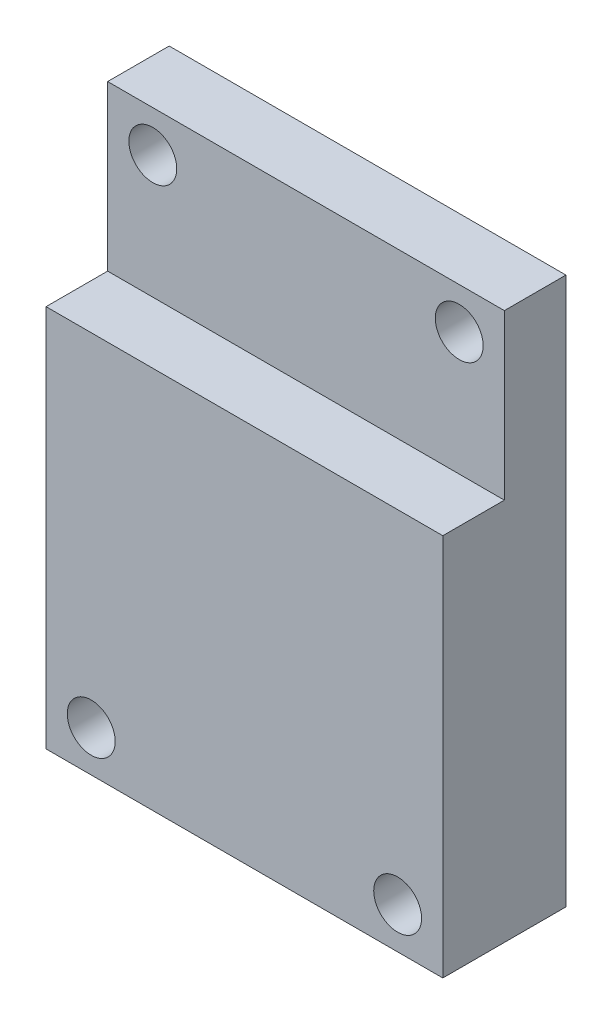
ISO-10303-21;
HEADER;
FILE_DESCRIPTION(('STEP AP214'),'2;1');
FILE_NAME('part.step','',(''),(''),'','','');
FILE_SCHEMA(('AUTOMOTIVE_DESIGN { 1 0 10303 214 1 1 1 1 }'));
ENDSEC;
DATA;
#1=APPLICATION_CONTEXT('core data for automotive mechanical design processes');
#2=APPLICATION_PROTOCOL_DEFINITION('international standard','automotive_design',2000,#1);
#3=PRODUCT_CONTEXT('',#1,'mechanical');
#4=PRODUCT('Part','Part','',(#3));
#5=PRODUCT_RELATED_PRODUCT_CATEGORY('part','',(#4));
#6=PRODUCT_DEFINITION_FORMATION('','',#4);
#7=PRODUCT_DEFINITION_CONTEXT('part definition',#1,'design');
#8=PRODUCT_DEFINITION('design','',#6,#7);
#9=PRODUCT_DEFINITION_SHAPE('','',#8);
#10=(LENGTH_UNIT() NAMED_UNIT(*) SI_UNIT(.MILLI.,.METRE.));
#11=(NAMED_UNIT(*) PLANE_ANGLE_UNIT() SI_UNIT($,.RADIAN.));
#12=(NAMED_UNIT(*) SI_UNIT($,.STERADIAN.) SOLID_ANGLE_UNIT());
#13=UNCERTAINTY_MEASURE_WITH_UNIT(LENGTH_MEASURE(1.E-05),#10,'distance_accuracy_value','');
#14=(GEOMETRIC_REPRESENTATION_CONTEXT(3) GLOBAL_UNCERTAINTY_ASSIGNED_CONTEXT((#13)) GLOBAL_UNIT_ASSIGNED_CONTEXT((#10,
#11,#12)) REPRESENTATION_CONTEXT('',''));
#15=CARTESIAN_POINT('',(0.,0.,0.));
#16=DIRECTION('',(0.,0.,1.));
#17=DIRECTION('',(1.,0.,0.));
#18=AXIS2_PLACEMENT_3D('',#15,#16,#17);
#19=CARTESIAN_POINT('',(0.,0.,9.));
#20=DIRECTION('',(0.,0.,1.));
#21=DIRECTION('',(1.,0.,0.));
#22=AXIS2_PLACEMENT_3D('',#19,#20,#21);
#23=PLANE('',#22);
#24=DIRECTION('',(1.,0.,0.));
#25=VECTOR('',#24,1.);
#26=CARTESIAN_POINT('',(0.,8.,9.));
#27=LINE('',#26,#25);
#28=CARTESIAN_POINT('',(-14.5,8.,9.));
#29=VERTEX_POINT('',#28);
#30=CARTESIAN_POINT('',(14.5,8.,9.));
#31=VERTEX_POINT('',#30);
#32=EDGE_CURVE('E143',#29,#31,#27,.T.);
#33=ORIENTED_EDGE('',*,*,#32,.F.);
#34=DIRECTION('',(0.,-1.,0.));
#35=VECTOR('',#34,1.);
#36=CARTESIAN_POINT('',(-14.5,-20.,9.));
#37=LINE('',#36,#35);
#38=CARTESIAN_POINT('',(-14.5,-20.,9.));
#39=VERTEX_POINT('',#38);
#40=EDGE_CURVE('E99',#29,#39,#37,.T.);
#41=ORIENTED_EDGE('',*,*,#40,.T.);
#42=DIRECTION('',(1.,0.,0.));
#43=VECTOR('',#42,1.);
#44=CARTESIAN_POINT('',(14.5,-20.,9.));
#45=LINE('',#44,#43);
#46=CARTESIAN_POINT('',(14.5,-20.,9.));
#47=VERTEX_POINT('',#46);
#48=EDGE_CURVE('E58',#39,#47,#45,.T.);
#49=ORIENTED_EDGE('',*,*,#48,.T.);
#50=DIRECTION('',(0.,1.,0.));
#51=VECTOR('',#50,1.);
#52=CARTESIAN_POINT('',(14.5,-20.,9.));
#53=LINE('',#52,#51);
#54=EDGE_CURVE('E90',#47,#31,#53,.T.);
#55=ORIENTED_EDGE('',*,*,#54,.T.);
#56=EDGE_LOOP('',(#33,#41,#49,#55));
#57=FACE_BOUND('',#56,.T.);
#58=CARTESIAN_POINT('',(11.1994237541486,-17.,9.));
#59=DIRECTION('',(0.,0.,1.));
#60=DIRECTION('',(-1.,0.,0.));
#61=AXIS2_PLACEMENT_3D('',#58,#59,#60);
#62=CIRCLE('',#61,1.75);
#63=CARTESIAN_POINT('',(9.44942375414862,-17.,9.));
#64=VERTEX_POINT('',#63);
#65=EDGE_CURVE('E133',#64,#64,#62,.T.);
#66=ORIENTED_EDGE('',*,*,#65,.F.);
#67=EDGE_LOOP('',(#66));
#68=FACE_BOUND('',#67,.T.);
#69=CARTESIAN_POINT('',(-11.1994237541486,-17.,9.));
#70=DIRECTION('',(0.,0.,1.));
#71=DIRECTION('',(-1.,0.,0.));
#72=AXIS2_PLACEMENT_3D('',#69,#70,#71);
#73=CIRCLE('',#72,1.75);
#74=CARTESIAN_POINT('',(-12.9494237541486,-17.,9.));
#75=VERTEX_POINT('',#74);
#76=EDGE_CURVE('E137',#75,#75,#73,.T.);
#77=ORIENTED_EDGE('',*,*,#76,.F.);
#78=EDGE_LOOP('',(#77));
#79=FACE_BOUND('',#78,.T.);
#80=ADVANCED_FACE('F33',(#57,#68,#79),#23,.T.);
#81=CARTESIAN_POINT('',(0.,0.,0.));
#82=DIRECTION('',(0.,0.,1.));
#83=DIRECTION('',(1.,0.,0.));
#84=AXIS2_PLACEMENT_3D('',#81,#82,#83);
#85=PLANE('',#84);
#86=DIRECTION('',(0.,-1.,0.));
#87=VECTOR('',#86,1.);
#88=CARTESIAN_POINT('',(-14.5,-20.,0.));
#89=LINE('',#88,#87);
#90=CARTESIAN_POINT('',(-14.5,20.,0.));
#91=VERTEX_POINT('',#90);
#92=CARTESIAN_POINT('',(-14.5,-20.,0.));
#93=VERTEX_POINT('',#92);
#94=EDGE_CURVE('E83',#91,#93,#89,.T.);
#95=ORIENTED_EDGE('',*,*,#94,.F.);
#96=DIRECTION('',(-1.,0.,0.));
#97=VECTOR('',#96,1.);
#98=CARTESIAN_POINT('',(14.5,20.,0.));
#99=LINE('',#98,#97);
#100=CARTESIAN_POINT('',(14.5,20.,0.));
#101=VERTEX_POINT('',#100);
#102=EDGE_CURVE('E93',#101,#91,#99,.T.);
#103=ORIENTED_EDGE('',*,*,#102,.F.);
#104=DIRECTION('',(0.,1.,0.));
#105=VECTOR('',#104,1.);
#106=CARTESIAN_POINT('',(14.5,-20.,0.));
#107=LINE('',#106,#105);
#108=CARTESIAN_POINT('',(14.5,-20.,0.));
#109=VERTEX_POINT('',#108);
#110=EDGE_CURVE('E100',#109,#101,#107,.T.);
#111=ORIENTED_EDGE('',*,*,#110,.F.);
#112=DIRECTION('',(1.,0.,0.));
#113=VECTOR('',#112,1.);
#114=CARTESIAN_POINT('',(14.5,-20.,0.));
#115=LINE('',#114,#113);
#116=EDGE_CURVE('E104',#93,#109,#115,.T.);
#117=ORIENTED_EDGE('',*,*,#116,.F.);
#118=EDGE_LOOP('',(#95,#103,#111,#117));
#119=FACE_BOUND('',#118,.T.);
#120=CARTESIAN_POINT('',(11.1994237541486,17.,0.));
#121=DIRECTION('',(0.,0.,1.));
#122=DIRECTION('',(1.,0.,0.));
#123=AXIS2_PLACEMENT_3D('',#120,#121,#122);
#124=CIRCLE('',#123,1.75);
#125=CARTESIAN_POINT('',(12.9494237541486,17.,0.));
#126=VERTEX_POINT('',#125);
#127=EDGE_CURVE('E105',#126,#126,#124,.T.);
#128=ORIENTED_EDGE('',*,*,#127,.T.);
#129=EDGE_LOOP('',(#128));
#130=FACE_BOUND('',#129,.T.);
#131=CARTESIAN_POINT('',(-11.1994237541486,17.,0.));
#132=DIRECTION('',(0.,0.,1.));
#133=DIRECTION('',(1.,0.,0.));
#134=AXIS2_PLACEMENT_3D('',#131,#132,#133);
#135=CIRCLE('',#134,1.75);
#136=CARTESIAN_POINT('',(-9.4494237541486,17.,0.));
#137=VERTEX_POINT('',#136);
#138=EDGE_CURVE('E109',#137,#137,#135,.T.);
#139=ORIENTED_EDGE('',*,*,#138,.T.);
#140=EDGE_LOOP('',(#139));
#141=FACE_BOUND('',#140,.T.);
#142=CARTESIAN_POINT('',(11.1994237541486,-17.,0.));
#143=DIRECTION('',(0.,0.,1.));
#144=DIRECTION('',(-1.,0.,0.));
#145=AXIS2_PLACEMENT_3D('',#142,#143,#144);
#146=CIRCLE('',#145,1.75);
#147=CARTESIAN_POINT('',(9.44942375414862,-17.,0.));
#148=VERTEX_POINT('',#147);
#149=EDGE_CURVE('E134',#148,#148,#146,.T.);
#150=ORIENTED_EDGE('',*,*,#149,.T.);
#151=EDGE_LOOP('',(#150));
#152=FACE_BOUND('',#151,.T.);
#153=CARTESIAN_POINT('',(-11.1994237541486,-17.,0.));
#154=DIRECTION('',(0.,0.,1.));
#155=DIRECTION('',(-1.,0.,0.));
#156=AXIS2_PLACEMENT_3D('',#153,#154,#155);
#157=CIRCLE('',#156,1.75);
#158=CARTESIAN_POINT('',(-12.9494237541486,-17.,0.));
#159=VERTEX_POINT('',#158);
#160=EDGE_CURVE('E140',#159,#159,#157,.T.);
#161=ORIENTED_EDGE('',*,*,#160,.T.);
#162=EDGE_LOOP('',(#161));
#163=FACE_BOUND('',#162,.T.);
#164=ADVANCED_FACE('F102',(#119,#130,#141,#152,#163),#85,.F.);
#165=CARTESIAN_POINT('',(-14.5,-20.,9.));
#166=DIRECTION('',(1.,0.,0.));
#167=DIRECTION('',(0.,0.,-1.));
#168=AXIS2_PLACEMENT_3D('',#165,#166,#167);
#169=PLANE('',#168);
#170=ORIENTED_EDGE('',*,*,#40,.F.);
#171=DIRECTION('',(0.,0.,-1.));
#172=VECTOR('',#171,1.);
#173=CARTESIAN_POINT('',(-14.5,8.,9.5));
#174=LINE('',#173,#172);
#175=CARTESIAN_POINT('',(-14.5,8.,4.5));
#176=VERTEX_POINT('',#175);
#177=EDGE_CURVE('E126',#29,#176,#174,.T.);
#178=ORIENTED_EDGE('',*,*,#177,.T.);
#179=DIRECTION('',(0.,1.,0.));
#180=VECTOR('',#179,1.);
#181=CARTESIAN_POINT('',(-14.5,20.,4.5));
#182=LINE('',#181,#180);
#183=CARTESIAN_POINT('',(-14.5,20.,4.5));
#184=VERTEX_POINT('',#183);
#185=EDGE_CURVE('E87',#176,#184,#182,.T.);
#186=ORIENTED_EDGE('',*,*,#185,.T.);
#187=DIRECTION('',(0.,0.,-1.));
#188=VECTOR('',#187,1.);
#189=CARTESIAN_POINT('',(-14.5,20.,9.));
#190=LINE('',#189,#188);
#191=EDGE_CURVE('E78',#184,#91,#190,.T.);
#192=ORIENTED_EDGE('',*,*,#191,.T.);
#193=ORIENTED_EDGE('',*,*,#94,.T.);
#194=DIRECTION('',(0.,0.,-1.));
#195=VECTOR('',#194,1.);
#196=CARTESIAN_POINT('',(-14.5,-20.,9.));
#197=LINE('',#196,#195);
#198=EDGE_CURVE('E11',#39,#93,#197,.T.);
#199=ORIENTED_EDGE('',*,*,#198,.F.);
#200=EDGE_LOOP('',(#170,#178,#186,#192,#193,#199));
#201=FACE_BOUND('',#200,.T.);
#202=ADVANCED_FACE('F35',(#201),#169,.F.);
#203=CARTESIAN_POINT('',(14.5,-20.,9.));
#204=DIRECTION('',(0.,1.,0.));
#205=DIRECTION('',(0.,0.,1.));
#206=AXIS2_PLACEMENT_3D('',#203,#204,#205);
#207=PLANE('',#206);
#208=ORIENTED_EDGE('',*,*,#116,.T.);
#209=DIRECTION('',(0.,0.,-1.));
#210=VECTOR('',#209,1.);
#211=CARTESIAN_POINT('',(14.5,-20.,9.));
#212=LINE('',#211,#210);
#213=EDGE_CURVE('E42',#47,#109,#212,.T.);
#214=ORIENTED_EDGE('',*,*,#213,.F.);
#215=ORIENTED_EDGE('',*,*,#48,.F.);
#216=ORIENTED_EDGE('',*,*,#198,.T.);
#217=EDGE_LOOP('',(#208,#214,#215,#216));
#218=FACE_BOUND('',#217,.T.);
#219=ADVANCED_FACE('F122',(#218),#207,.F.);
#220=CARTESIAN_POINT('',(14.5,-20.,9.));
#221=DIRECTION('',(-1.,0.,0.));
#222=DIRECTION('',(0.,0.,1.));
#223=AXIS2_PLACEMENT_3D('',#220,#221,#222);
#224=PLANE('',#223);
#225=DIRECTION('',(0.,-1.,0.));
#226=VECTOR('',#225,1.);
#227=CARTESIAN_POINT('',(14.5,20.,4.5));
#228=LINE('',#227,#226);
#229=CARTESIAN_POINT('',(14.5,20.,4.5));
#230=VERTEX_POINT('',#229);
#231=CARTESIAN_POINT('',(14.5,8.,4.5));
#232=VERTEX_POINT('',#231);
#233=EDGE_CURVE('E49',#230,#232,#228,.T.);
#234=ORIENTED_EDGE('',*,*,#233,.T.);
#235=DIRECTION('',(0.,0.,-1.));
#236=VECTOR('',#235,1.);
#237=CARTESIAN_POINT('',(14.5,8.,9.5));
#238=LINE('',#237,#236);
#239=EDGE_CURVE('E151',#31,#232,#238,.T.);
#240=ORIENTED_EDGE('',*,*,#239,.F.);
#241=ORIENTED_EDGE('',*,*,#54,.F.);
#242=ORIENTED_EDGE('',*,*,#213,.T.);
#243=ORIENTED_EDGE('',*,*,#110,.T.);
#244=DIRECTION('',(0.,0.,-1.));
#245=VECTOR('',#244,1.);
#246=CARTESIAN_POINT('',(14.5,20.,9.));
#247=LINE('',#246,#245);
#248=EDGE_CURVE('E89',#230,#101,#247,.T.);
#249=ORIENTED_EDGE('',*,*,#248,.F.);
#250=EDGE_LOOP('',(#234,#240,#241,#242,#243,#249));
#251=FACE_BOUND('',#250,.T.);
#252=ADVANCED_FACE('F119',(#251),#224,.F.);
#253=CARTESIAN_POINT('',(14.5,20.,9.));
#254=DIRECTION('',(0.,-1.,0.));
#255=DIRECTION('',(0.,0.,-1.));
#256=AXIS2_PLACEMENT_3D('',#253,#254,#255);
#257=PLANE('',#256);
#258=ORIENTED_EDGE('',*,*,#191,.F.);
#259=DIRECTION('',(1.,0.,0.));
#260=VECTOR('',#259,1.);
#261=CARTESIAN_POINT('',(14.5,20.,4.5));
#262=LINE('',#261,#260);
#263=EDGE_CURVE('E154',#184,#230,#262,.T.);
#264=ORIENTED_EDGE('',*,*,#263,.T.);
#265=ORIENTED_EDGE('',*,*,#248,.T.);
#266=ORIENTED_EDGE('',*,*,#102,.T.);
#267=EDGE_LOOP('',(#258,#264,#265,#266));
#268=FACE_BOUND('',#267,.T.);
#269=ADVANCED_FACE('F94',(#268),#257,.F.);
#270=CARTESIAN_POINT('',(11.1994237541486,17.,9.));
#271=DIRECTION('',(0.,0.,-1.));
#272=DIRECTION('',(-1.,0.,0.));
#273=AXIS2_PLACEMENT_3D('',#270,#271,#272);
#274=CYLINDRICAL_SURFACE('',#273,1.75);
#275=CARTESIAN_POINT('',(11.1994237541486,17.,4.5));
#276=DIRECTION('',(0.,0.,-1.));
#277=DIRECTION('',(-1.,0.,0.));
#278=AXIS2_PLACEMENT_3D('',#275,#276,#277);
#279=CIRCLE('',#278,1.75);
#280=CARTESIAN_POINT('',(9.44942375414862,17.,4.5));
#281=VERTEX_POINT('',#280);
#282=EDGE_CURVE('E148',#281,#281,#279,.T.);
#283=ORIENTED_EDGE('',*,*,#282,.F.);
#284=EDGE_LOOP('',(#283));
#285=FACE_BOUND('',#284,.T.);
#286=ORIENTED_EDGE('',*,*,#127,.F.);
#287=EDGE_LOOP('',(#286));
#288=FACE_BOUND('',#287,.T.);
#289=ADVANCED_FACE('F190',(#285,#288),#274,.F.);
#290=CARTESIAN_POINT('',(-11.1994237541486,17.,9.));
#291=DIRECTION('',(0.,0.,-1.));
#292=DIRECTION('',(-1.,0.,0.));
#293=AXIS2_PLACEMENT_3D('',#290,#291,#292);
#294=CYLINDRICAL_SURFACE('',#293,1.75);
#295=CARTESIAN_POINT('',(-11.1994237541486,17.,4.5));
#296=DIRECTION('',(0.,0.,-1.));
#297=DIRECTION('',(-1.,0.,0.));
#298=AXIS2_PLACEMENT_3D('',#295,#296,#297);
#299=CIRCLE('',#298,1.75);
#300=CARTESIAN_POINT('',(-12.9494237541486,17.,4.5));
#301=VERTEX_POINT('',#300);
#302=EDGE_CURVE('E37',#301,#301,#299,.T.);
#303=ORIENTED_EDGE('',*,*,#302,.F.);
#304=EDGE_LOOP('',(#303));
#305=FACE_BOUND('',#304,.T.);
#306=ORIENTED_EDGE('',*,*,#138,.F.);
#307=EDGE_LOOP('',(#306));
#308=FACE_BOUND('',#307,.T.);
#309=ADVANCED_FACE('F212',(#305,#308),#294,.F.);
#310=CARTESIAN_POINT('',(11.1994237541486,-17.,9.));
#311=DIRECTION('',(0.,0.,-1.));
#312=DIRECTION('',(-1.,0.,0.));
#313=AXIS2_PLACEMENT_3D('',#310,#311,#312);
#314=CYLINDRICAL_SURFACE('',#313,1.75);
#315=ORIENTED_EDGE('',*,*,#65,.T.);
#316=EDGE_LOOP('',(#315));
#317=FACE_BOUND('',#316,.T.);
#318=ORIENTED_EDGE('',*,*,#149,.F.);
#319=EDGE_LOOP('',(#318));
#320=FACE_BOUND('',#319,.T.);
#321=ADVANCED_FACE('F177',(#317,#320),#314,.F.);
#322=CARTESIAN_POINT('',(-11.1994237541486,-17.,9.));
#323=DIRECTION('',(0.,0.,-1.));
#324=DIRECTION('',(-1.,0.,0.));
#325=AXIS2_PLACEMENT_3D('',#322,#323,#324);
#326=CYLINDRICAL_SURFACE('',#325,1.75);
#327=ORIENTED_EDGE('',*,*,#76,.T.);
#328=EDGE_LOOP('',(#327));
#329=FACE_BOUND('',#328,.T.);
#330=ORIENTED_EDGE('',*,*,#160,.F.);
#331=EDGE_LOOP('',(#330));
#332=FACE_BOUND('',#331,.T.);
#333=ADVANCED_FACE('F174',(#329,#332),#326,.F.);
#334=CARTESIAN_POINT('',(14.5,8.,9.5));
#335=DIRECTION('',(0.,-1.,0.));
#336=DIRECTION('',(0.,0.,-1.));
#337=AXIS2_PLACEMENT_3D('',#334,#335,#336);
#338=PLANE('',#337);
#339=ORIENTED_EDGE('',*,*,#32,.T.);
#340=ORIENTED_EDGE('',*,*,#239,.T.);
#341=DIRECTION('',(-1.,0.,0.));
#342=VECTOR('',#341,1.);
#343=CARTESIAN_POINT('',(14.5,8.,4.5));
#344=LINE('',#343,#342);
#345=EDGE_CURVE('E158',#232,#176,#344,.T.);
#346=ORIENTED_EDGE('',*,*,#345,.T.);
#347=ORIENTED_EDGE('',*,*,#177,.F.);
#348=EDGE_LOOP('',(#339,#340,#346,#347));
#349=FACE_BOUND('',#348,.T.);
#350=ADVANCED_FACE('F166',(#349),#338,.F.);
#351=CARTESIAN_POINT('',(0.,0.,4.5));
#352=DIRECTION('',(0.,0.,-1.));
#353=DIRECTION('',(-1.,0.,0.));
#354=AXIS2_PLACEMENT_3D('',#351,#352,#353);
#355=PLANE('',#354);
#356=ORIENTED_EDGE('',*,*,#282,.T.);
#357=EDGE_LOOP('',(#356));
#358=FACE_BOUND('',#357,.T.);
#359=ORIENTED_EDGE('',*,*,#302,.T.);
#360=EDGE_LOOP('',(#359));
#361=FACE_BOUND('',#360,.T.);
#362=ORIENTED_EDGE('',*,*,#233,.F.);
#363=ORIENTED_EDGE('',*,*,#263,.F.);
#364=ORIENTED_EDGE('',*,*,#185,.F.);
#365=ORIENTED_EDGE('',*,*,#345,.F.);
#366=EDGE_LOOP('',(#362,#363,#364,#365));
#367=FACE_BOUND('',#366,.T.);
#368=ADVANCED_FACE('F237',(#358,#361,#367),#355,.F.);
#369=CLOSED_SHELL('',(#80,#164,#202,#219,#252,#269,#289,#309,#321,#333,#350,#368));
#370=MANIFOLD_SOLID_BREP('B2',#369);
#371=ADVANCED_BREP_SHAPE_REPRESENTATION('',(#18,#370),#14);
#372=SHAPE_DEFINITION_REPRESENTATION(#9,#371);
ENDSEC;
END-ISO-10303-21;
